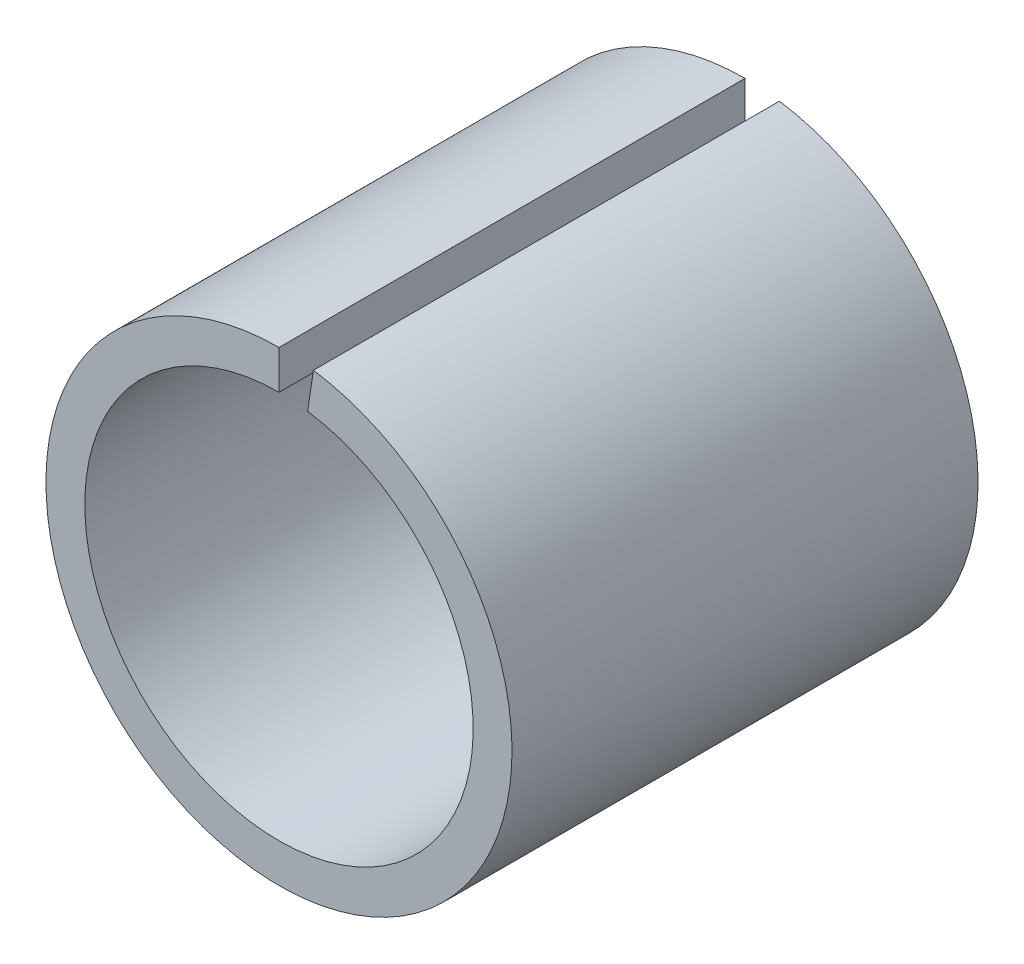
ISO-10303-21;
HEADER;
FILE_DESCRIPTION(('STEP AP214'),'2;1');
FILE_NAME('part.step','',(''),(''),'','','');
FILE_SCHEMA(('AUTOMOTIVE_DESIGN { 1 0 10303 214 1 1 1 1 }'));
ENDSEC;
DATA;
#1=APPLICATION_CONTEXT('core data for automotive mechanical design processes');
#2=APPLICATION_PROTOCOL_DEFINITION('international standard','automotive_design',2000,#1);
#3=PRODUCT_CONTEXT('',#1,'mechanical');
#4=PRODUCT('Part','Part','',(#3));
#5=PRODUCT_RELATED_PRODUCT_CATEGORY('part','',(#4));
#6=PRODUCT_DEFINITION_FORMATION('','',#4);
#7=PRODUCT_DEFINITION_CONTEXT('part definition',#1,'design');
#8=PRODUCT_DEFINITION('design','',#6,#7);
#9=PRODUCT_DEFINITION_SHAPE('','',#8);
#10=(LENGTH_UNIT() NAMED_UNIT(*) SI_UNIT(.MILLI.,.METRE.));
#11=(NAMED_UNIT(*) PLANE_ANGLE_UNIT() SI_UNIT($,.RADIAN.));
#12=(NAMED_UNIT(*) SI_UNIT($,.STERADIAN.) SOLID_ANGLE_UNIT());
#13=UNCERTAINTY_MEASURE_WITH_UNIT(LENGTH_MEASURE(1.E-05),#10,'distance_accuracy_value','');
#14=(GEOMETRIC_REPRESENTATION_CONTEXT(3) GLOBAL_UNCERTAINTY_ASSIGNED_CONTEXT((#13)) GLOBAL_UNIT_ASSIGNED_CONTEXT((#10,
#11,#12)) REPRESENTATION_CONTEXT('',''));
#15=CARTESIAN_POINT('',(0.,0.,0.));
#16=DIRECTION('',(0.,0.,1.));
#17=DIRECTION('',(1.,0.,0.));
#18=AXIS2_PLACEMENT_3D('',#15,#16,#17);
#19=CARTESIAN_POINT('',(0.,0.,12.));
#20=DIRECTION('',(0.,0.,1.));
#21=DIRECTION('',(1.,0.,0.));
#22=AXIS2_PLACEMENT_3D('',#19,#20,#21);
#23=PLANE('',#22);
#24=DIRECTION('',(0.147573935389643,0.989051026789626,0.));
#25=VECTOR('',#24,1.);
#26=CARTESIAN_POINT('',(1.72090616388232,11.5336356918476,12.));
#27=LINE('',#26,#25);
#28=CARTESIAN_POINT('',(0.737869676948216,4.94525513394813,12.));
#29=VERTEX_POINT('',#28);
#30=CARTESIAN_POINT('',(0.885443612337859,5.93430616073776,12.));
#31=VERTEX_POINT('',#30);
#32=EDGE_CURVE('E92',#29,#31,#27,.T.);
#33=ORIENTED_EDGE('',*,*,#32,.F.);
#34=CARTESIAN_POINT('',(0.,0.,12.));
#35=DIRECTION('',(0.,0.,1.));
#36=DIRECTION('',(1.,0.,0.));
#37=AXIS2_PLACEMENT_3D('',#34,#35,#36);
#38=CIRCLE('',#37,5.);
#39=CARTESIAN_POINT('',(0.,5.,12.));
#40=VERTEX_POINT('',#39);
#41=EDGE_CURVE('E91',#40,#29,#38,.T.);
#42=ORIENTED_EDGE('',*,*,#41,.F.);
#43=DIRECTION('',(0.,-1.,0.));
#44=VECTOR('',#43,1.);
#45=CARTESIAN_POINT('',(0.,0.,12.));
#46=LINE('',#45,#44);
#47=CARTESIAN_POINT('',(0.,6.,12.));
#48=VERTEX_POINT('',#47);
#49=EDGE_CURVE('E60',#48,#40,#46,.T.);
#50=ORIENTED_EDGE('',*,*,#49,.F.);
#51=CARTESIAN_POINT('',(0.,0.,12.));
#52=DIRECTION('',(0.,0.,1.));
#53=DIRECTION('',(1.,0.,0.));
#54=AXIS2_PLACEMENT_3D('',#51,#52,#53);
#55=CIRCLE('',#54,6.);
#56=EDGE_CURVE('E89',#48,#31,#55,.T.);
#57=ORIENTED_EDGE('',*,*,#56,.T.);
#58=EDGE_LOOP('',(#33,#42,#50,#57));
#59=FACE_BOUND('',#58,.T.);
#60=ADVANCED_FACE('F38',(#59),#23,.T.);
#61=CARTESIAN_POINT('',(0.,0.,0.));
#62=DIRECTION('',(0.,0.,1.));
#63=DIRECTION('',(1.,0.,0.));
#64=AXIS2_PLACEMENT_3D('',#61,#62,#63);
#65=PLANE('',#64);
#66=CARTESIAN_POINT('',(0.,0.,0.));
#67=DIRECTION('',(0.,0.,1.));
#68=DIRECTION('',(1.,0.,0.));
#69=AXIS2_PLACEMENT_3D('',#66,#67,#68);
#70=CIRCLE('',#69,5.);
#71=CARTESIAN_POINT('',(0.,5.,0.));
#72=VERTEX_POINT('',#71);
#73=CARTESIAN_POINT('',(0.737869676948216,4.94525513394813,0.));
#74=VERTEX_POINT('',#73);
#75=EDGE_CURVE('E100',#72,#74,#70,.T.);
#76=ORIENTED_EDGE('',*,*,#75,.T.);
#77=DIRECTION('',(0.147573935389643,0.989051026789626,0.));
#78=VECTOR('',#77,1.);
#79=CARTESIAN_POINT('',(0.,0.,0.));
#80=LINE('',#79,#78);
#81=CARTESIAN_POINT('',(0.88544361233786,5.93430616073776,0.));
#82=VERTEX_POINT('',#81);
#83=EDGE_CURVE('E52',#74,#82,#80,.T.);
#84=ORIENTED_EDGE('',*,*,#83,.T.);
#85=CARTESIAN_POINT('',(0.,0.,0.));
#86=DIRECTION('',(0.,0.,1.));
#87=DIRECTION('',(1.,0.,0.));
#88=AXIS2_PLACEMENT_3D('',#85,#86,#87);
#89=CIRCLE('',#88,6.);
#90=CARTESIAN_POINT('',(0.,6.,0.));
#91=VERTEX_POINT('',#90);
#92=EDGE_CURVE('E96',#91,#82,#89,.T.);
#93=ORIENTED_EDGE('',*,*,#92,.F.);
#94=DIRECTION('',(0.,-1.,0.));
#95=VECTOR('',#94,1.);
#96=CARTESIAN_POINT('',(0.,0.,0.));
#97=LINE('',#96,#95);
#98=EDGE_CURVE('E79',#91,#72,#97,.T.);
#99=ORIENTED_EDGE('',*,*,#98,.T.);
#100=EDGE_LOOP('',(#76,#84,#93,#99));
#101=FACE_BOUND('',#100,.T.);
#102=ADVANCED_FACE('F112',(#101),#65,.F.);
#103=CARTESIAN_POINT('',(0.,0.,12.));
#104=DIRECTION('',(0.,0.,-1.));
#105=DIRECTION('',(-1.,0.,0.));
#106=AXIS2_PLACEMENT_3D('',#103,#104,#105);
#107=CYLINDRICAL_SURFACE('',#106,6.);
#108=ORIENTED_EDGE('',*,*,#92,.T.);
#109=DIRECTION('',(0.,0.,-1.));
#110=VECTOR('',#109,1.);
#111=CARTESIAN_POINT('',(0.885443612337859,5.93430616073776,12.));
#112=LINE('',#111,#110);
#113=EDGE_CURVE('E95',#82,#31,#112,.F.);
#114=ORIENTED_EDGE('',*,*,#113,.T.);
#115=ORIENTED_EDGE('',*,*,#56,.F.);
#116=DIRECTION('',(0.,0.,1.));
#117=VECTOR('',#116,1.);
#118=CARTESIAN_POINT('',(0.,6.,-8.));
#119=LINE('',#118,#117);
#120=EDGE_CURVE('E76',#91,#48,#119,.T.);
#121=ORIENTED_EDGE('',*,*,#120,.F.);
#122=EDGE_LOOP('',(#108,#114,#115,#121));
#123=FACE_BOUND('',#122,.T.);
#124=ADVANCED_FACE('F40',(#123),#107,.T.);
#125=CARTESIAN_POINT('',(0.,0.,12.));
#126=DIRECTION('',(0.,0.,-1.));
#127=DIRECTION('',(-1.,0.,0.));
#128=AXIS2_PLACEMENT_3D('',#125,#126,#127);
#129=CYLINDRICAL_SURFACE('',#128,5.);
#130=DIRECTION('',(0.,0.,-1.));
#131=VECTOR('',#130,1.);
#132=CARTESIAN_POINT('',(0.737869676948216,4.94525513394813,12.));
#133=LINE('',#132,#131);
#134=EDGE_CURVE('E11',#74,#29,#133,.F.);
#135=ORIENTED_EDGE('',*,*,#134,.F.);
#136=ORIENTED_EDGE('',*,*,#75,.F.);
#137=DIRECTION('',(0.,0.,-1.));
#138=VECTOR('',#137,1.);
#139=CARTESIAN_POINT('',(0.,5.,12.));
#140=LINE('',#139,#138);
#141=EDGE_CURVE('E46',#40,#72,#140,.T.);
#142=ORIENTED_EDGE('',*,*,#141,.F.);
#143=ORIENTED_EDGE('',*,*,#41,.T.);
#144=EDGE_LOOP('',(#135,#136,#142,#143));
#145=FACE_BOUND('',#144,.T.);
#146=ADVANCED_FACE('F109',(#145),#129,.F.);
#147=CARTESIAN_POINT('',(0.,0.,-8.));
#148=DIRECTION('',(-1.,0.,0.));
#149=DIRECTION('',(0.,0.,1.));
#150=AXIS2_PLACEMENT_3D('',#147,#148,#149);
#151=PLANE('',#150);
#152=ORIENTED_EDGE('',*,*,#120,.T.);
#153=ORIENTED_EDGE('',*,*,#49,.T.);
#154=ORIENTED_EDGE('',*,*,#141,.T.);
#155=ORIENTED_EDGE('',*,*,#98,.F.);
#156=EDGE_LOOP('',(#152,#153,#154,#155));
#157=FACE_BOUND('',#156,.T.);
#158=ADVANCED_FACE('F77',(#157),#151,.F.);
#159=CARTESIAN_POINT('',(1.72090616388232,11.5336356918476,-8.));
#160=DIRECTION('',(0.989051026789626,-0.147573935389643,0.));
#161=DIRECTION('',(0.147573935389643,0.989051026789626,0.));
#162=AXIS2_PLACEMENT_3D('',#159,#160,#161);
#163=PLANE('',#162);
#164=ORIENTED_EDGE('',*,*,#83,.F.);
#165=ORIENTED_EDGE('',*,*,#134,.T.);
#166=ORIENTED_EDGE('',*,*,#32,.T.);
#167=ORIENTED_EDGE('',*,*,#113,.F.);
#168=EDGE_LOOP('',(#164,#165,#166,#167));
#169=FACE_BOUND('',#168,.T.);
#170=ADVANCED_FACE('F107',(#169),#163,.F.);
#171=CLOSED_SHELL('',(#60,#102,#124,#146,#158,#170));
#172=MANIFOLD_SOLID_BREP('B2',#171);
#173=ADVANCED_BREP_SHAPE_REPRESENTATION('',(#18,#172),#14);
#174=SHAPE_DEFINITION_REPRESENTATION(#9,#173);
ENDSEC;
END-ISO-10303-21;
